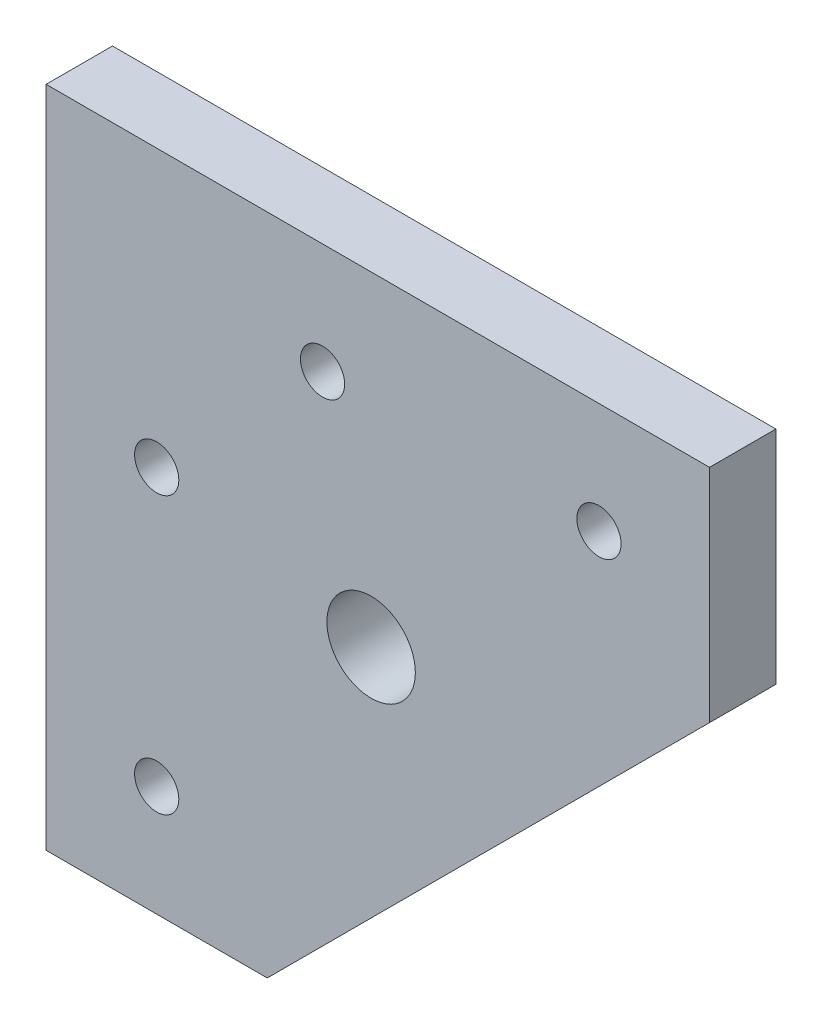
ISO-10303-21;
HEADER;
FILE_DESCRIPTION(('STEP AP214'),'2;1');
FILE_NAME('part.step','',(''),(''),'','','');
FILE_SCHEMA(('AUTOMOTIVE_DESIGN { 1 0 10303 214 1 1 1 1 }'));
ENDSEC;
DATA;
#1=APPLICATION_CONTEXT('core data for automotive mechanical design processes');
#2=APPLICATION_PROTOCOL_DEFINITION('international standard','automotive_design',2000,#1);
#3=PRODUCT_CONTEXT('',#1,'mechanical');
#4=PRODUCT('Part','Part','',(#3));
#5=PRODUCT_RELATED_PRODUCT_CATEGORY('part','',(#4));
#6=PRODUCT_DEFINITION_FORMATION('','',#4);
#7=PRODUCT_DEFINITION_CONTEXT('part definition',#1,'design');
#8=PRODUCT_DEFINITION('design','',#6,#7);
#9=PRODUCT_DEFINITION_SHAPE('','',#8);
#10=(LENGTH_UNIT() NAMED_UNIT(*) SI_UNIT(.MILLI.,.METRE.));
#11=(NAMED_UNIT(*) PLANE_ANGLE_UNIT() SI_UNIT($,.RADIAN.));
#12=(NAMED_UNIT(*) SI_UNIT($,.STERADIAN.) SOLID_ANGLE_UNIT());
#13=UNCERTAINTY_MEASURE_WITH_UNIT(LENGTH_MEASURE(1.E-05),#10,'distance_accuracy_value','');
#14=(GEOMETRIC_REPRESENTATION_CONTEXT(3) GLOBAL_UNCERTAINTY_ASSIGNED_CONTEXT((#13)) GLOBAL_UNIT_ASSIGNED_CONTEXT((#10,
#11,#12)) REPRESENTATION_CONTEXT('',''));
#15=CARTESIAN_POINT('',(0.,0.,0.));
#16=DIRECTION('',(0.,0.,1.));
#17=DIRECTION('',(1.,0.,0.));
#18=AXIS2_PLACEMENT_3D('',#15,#16,#17);
#19=CARTESIAN_POINT('',(0.,0.,6.));
#20=DIRECTION('',(0.,0.,1.));
#21=DIRECTION('',(1.,0.,0.));
#22=AXIS2_PLACEMENT_3D('',#19,#20,#21);
#23=PLANE('',#22);
#24=CARTESIAN_POINT('',(10.,-25.,6.));
#25=DIRECTION('',(0.,0.,1.));
#26=DIRECTION('',(1.,0.,0.));
#27=AXIS2_PLACEMENT_3D('',#24,#25,#26);
#28=CIRCLE('',#27,2.);
#29=CARTESIAN_POINT('',(12.,-25.,6.));
#30=VERTEX_POINT('',#29);
#31=EDGE_CURVE('E176',#30,#30,#28,.T.);
#32=ORIENTED_EDGE('',*,*,#31,.F.);
#33=EDGE_LOOP('',(#32));
#34=FACE_BOUND('',#33,.T.);
#35=CARTESIAN_POINT('',(25.,-10.,6.));
#36=DIRECTION('',(0.,0.,1.));
#37=DIRECTION('',(1.,0.,0.));
#38=AXIS2_PLACEMENT_3D('',#35,#36,#37);
#39=CIRCLE('',#38,2.);
#40=CARTESIAN_POINT('',(27.,-10.,6.));
#41=VERTEX_POINT('',#40);
#42=EDGE_CURVE('E188',#41,#41,#39,.T.);
#43=ORIENTED_EDGE('',*,*,#42,.F.);
#44=EDGE_LOOP('',(#43));
#45=FACE_BOUND('',#44,.T.);
#46=DIRECTION('',(0.,-1.,0.));
#47=VECTOR('',#46,1.);
#48=CARTESIAN_POINT('',(0.,0.,6.));
#49=LINE('',#48,#47);
#50=CARTESIAN_POINT('',(0.,0.,6.));
#51=VERTEX_POINT('',#50);
#52=CARTESIAN_POINT('',(0.,-60.,6.));
#53=VERTEX_POINT('',#52);
#54=EDGE_CURVE('E117',#51,#53,#49,.T.);
#55=ORIENTED_EDGE('',*,*,#54,.T.);
#56=DIRECTION('',(1.,0.,0.));
#57=VECTOR('',#56,1.);
#58=CARTESIAN_POINT('',(0.,-60.,6.));
#59=LINE('',#58,#57);
#60=CARTESIAN_POINT('',(20.,-60.,6.));
#61=VERTEX_POINT('',#60);
#62=EDGE_CURVE('E84',#53,#61,#59,.T.);
#63=ORIENTED_EDGE('',*,*,#62,.T.);
#64=DIRECTION('',(0.707106781186548,0.707106781186548,0.));
#65=VECTOR('',#64,1.);
#66=CARTESIAN_POINT('',(20.,-60.,6.));
#67=LINE('',#66,#65);
#68=CARTESIAN_POINT('',(60.,-20.,6.));
#69=VERTEX_POINT('',#68);
#70=EDGE_CURVE('E88',#61,#69,#67,.T.);
#71=ORIENTED_EDGE('',*,*,#70,.T.);
#72=DIRECTION('',(0.,1.,0.));
#73=VECTOR('',#72,1.);
#74=CARTESIAN_POINT('',(60.,0.,6.));
#75=LINE('',#74,#73);
#76=CARTESIAN_POINT('',(60.,0.,6.));
#77=VERTEX_POINT('',#76);
#78=EDGE_CURVE('E92',#69,#77,#75,.T.);
#79=ORIENTED_EDGE('',*,*,#78,.T.);
#80=DIRECTION('',(-1.,0.,0.));
#81=VECTOR('',#80,1.);
#82=CARTESIAN_POINT('',(0.,0.,6.));
#83=LINE('',#82,#81);
#84=EDGE_CURVE('E50',#77,#51,#83,.T.);
#85=ORIENTED_EDGE('',*,*,#84,.T.);
#86=EDGE_LOOP('',(#55,#63,#71,#79,#85));
#87=FACE_BOUND('',#86,.T.);
#88=CARTESIAN_POINT('',(50.,-10.,6.));
#89=DIRECTION('',(0.,0.,1.));
#90=DIRECTION('',(1.,0.,0.));
#91=AXIS2_PLACEMENT_3D('',#88,#89,#90);
#92=CIRCLE('',#91,2.);
#93=CARTESIAN_POINT('',(52.,-10.,6.));
#94=VERTEX_POINT('',#93);
#95=EDGE_CURVE('E112',#94,#94,#92,.T.);
#96=ORIENTED_EDGE('',*,*,#95,.F.);
#97=EDGE_LOOP('',(#96));
#98=FACE_BOUND('',#97,.T.);
#99=CARTESIAN_POINT('',(10.,-50.,6.));
#100=DIRECTION('',(0.,0.,1.));
#101=DIRECTION('',(1.,0.,0.));
#102=AXIS2_PLACEMENT_3D('',#99,#100,#101);
#103=CIRCLE('',#102,2.);
#104=CARTESIAN_POINT('',(12.,-50.,6.));
#105=VERTEX_POINT('',#104);
#106=EDGE_CURVE('E182',#105,#105,#103,.T.);
#107=ORIENTED_EDGE('',*,*,#106,.F.);
#108=EDGE_LOOP('',(#107));
#109=FACE_BOUND('',#108,.T.);
#110=CARTESIAN_POINT('',(29.3933982822018,-29.3933982822018,6.));
#111=DIRECTION('',(0.,0.,1.));
#112=DIRECTION('',(1.,0.,0.));
#113=AXIS2_PLACEMENT_3D('',#110,#111,#112);
#114=CIRCLE('',#113,4.00000000000001);
#115=CARTESIAN_POINT('',(33.3933982822018,-29.3933982822018,6.));
#116=VERTEX_POINT('',#115);
#117=EDGE_CURVE('E167',#116,#116,#114,.T.);
#118=ORIENTED_EDGE('',*,*,#117,.F.);
#119=EDGE_LOOP('',(#118));
#120=FACE_BOUND('',#119,.T.);
#121=ADVANCED_FACE('F33',(#34,#45,#87,#98,#109,#120),#23,.T.);
#122=CARTESIAN_POINT('',(0.,0.,0.));
#123=DIRECTION('',(0.,0.,1.));
#124=DIRECTION('',(1.,0.,0.));
#125=AXIS2_PLACEMENT_3D('',#122,#123,#124);
#126=PLANE('',#125);
#127=DIRECTION('',(0.,-1.,0.));
#128=VECTOR('',#127,1.);
#129=CARTESIAN_POINT('',(0.,0.,0.));
#130=LINE('',#129,#128);
#131=CARTESIAN_POINT('',(0.,0.,0.));
#132=VERTEX_POINT('',#131);
#133=CARTESIAN_POINT('',(0.,-60.,0.));
#134=VERTEX_POINT('',#133);
#135=EDGE_CURVE('E108',#132,#134,#130,.T.);
#136=ORIENTED_EDGE('',*,*,#135,.F.);
#137=DIRECTION('',(-1.,0.,0.));
#138=VECTOR('',#137,1.);
#139=CARTESIAN_POINT('',(0.,0.,0.));
#140=LINE('',#139,#138);
#141=CARTESIAN_POINT('',(60.,0.,0.));
#142=VERTEX_POINT('',#141);
#143=EDGE_CURVE('E76',#142,#132,#140,.T.);
#144=ORIENTED_EDGE('',*,*,#143,.F.);
#145=DIRECTION('',(0.,1.,0.));
#146=VECTOR('',#145,1.);
#147=CARTESIAN_POINT('',(60.,0.,0.));
#148=LINE('',#147,#146);
#149=CARTESIAN_POINT('',(60.,-20.,0.));
#150=VERTEX_POINT('',#149);
#151=EDGE_CURVE('E70',#150,#142,#148,.T.);
#152=ORIENTED_EDGE('',*,*,#151,.F.);
#153=DIRECTION('',(0.707106781186548,0.707106781186548,0.));
#154=VECTOR('',#153,1.);
#155=CARTESIAN_POINT('',(20.,-60.,0.));
#156=LINE('',#155,#154);
#157=CARTESIAN_POINT('',(20.,-60.,0.));
#158=VERTEX_POINT('',#157);
#159=EDGE_CURVE('E99',#158,#150,#156,.T.);
#160=ORIENTED_EDGE('',*,*,#159,.F.);
#161=DIRECTION('',(1.,0.,0.));
#162=VECTOR('',#161,1.);
#163=CARTESIAN_POINT('',(0.,-60.,0.));
#164=LINE('',#163,#162);
#165=EDGE_CURVE('E111',#134,#158,#164,.T.);
#166=ORIENTED_EDGE('',*,*,#165,.F.);
#167=EDGE_LOOP('',(#136,#144,#152,#160,#166));
#168=FACE_BOUND('',#167,.T.);
#169=CARTESIAN_POINT('',(50.,-10.,0.));
#170=DIRECTION('',(0.,0.,1.));
#171=DIRECTION('',(1.,0.,0.));
#172=AXIS2_PLACEMENT_3D('',#169,#170,#171);
#173=CIRCLE('',#172,2.);
#174=CARTESIAN_POINT('',(52.,-10.,0.));
#175=VERTEX_POINT('',#174);
#176=EDGE_CURVE('E191',#175,#175,#173,.T.);
#177=ORIENTED_EDGE('',*,*,#176,.T.);
#178=EDGE_LOOP('',(#177));
#179=FACE_BOUND('',#178,.T.);
#180=CARTESIAN_POINT('',(25.,-10.,0.));
#181=DIRECTION('',(0.,0.,1.));
#182=DIRECTION('',(1.,0.,0.));
#183=AXIS2_PLACEMENT_3D('',#180,#181,#182);
#184=CIRCLE('',#183,2.);
#185=CARTESIAN_POINT('',(27.,-10.,0.));
#186=VERTEX_POINT('',#185);
#187=EDGE_CURVE('E185',#186,#186,#184,.T.);
#188=ORIENTED_EDGE('',*,*,#187,.T.);
#189=EDGE_LOOP('',(#188));
#190=FACE_BOUND('',#189,.T.);
#191=CARTESIAN_POINT('',(10.,-50.,0.));
#192=DIRECTION('',(0.,0.,1.));
#193=DIRECTION('',(1.,0.,0.));
#194=AXIS2_PLACEMENT_3D('',#191,#192,#193);
#195=CIRCLE('',#194,2.);
#196=CARTESIAN_POINT('',(12.,-50.,0.));
#197=VERTEX_POINT('',#196);
#198=EDGE_CURVE('E179',#197,#197,#195,.T.);
#199=ORIENTED_EDGE('',*,*,#198,.T.);
#200=EDGE_LOOP('',(#199));
#201=FACE_BOUND('',#200,.T.);
#202=CARTESIAN_POINT('',(10.,-25.,0.));
#203=DIRECTION('',(0.,0.,1.));
#204=DIRECTION('',(1.,0.,0.));
#205=AXIS2_PLACEMENT_3D('',#202,#203,#204);
#206=CIRCLE('',#205,2.);
#207=CARTESIAN_POINT('',(12.,-25.,0.));
#208=VERTEX_POINT('',#207);
#209=EDGE_CURVE('E173',#208,#208,#206,.T.);
#210=ORIENTED_EDGE('',*,*,#209,.T.);
#211=EDGE_LOOP('',(#210));
#212=FACE_BOUND('',#211,.T.);
#213=CARTESIAN_POINT('',(29.3933982822018,-29.3933982822018,0.));
#214=DIRECTION('',(0.,0.,1.));
#215=DIRECTION('',(1.,0.,0.));
#216=AXIS2_PLACEMENT_3D('',#213,#214,#215);
#217=CIRCLE('',#216,4.00000000000001);
#218=CARTESIAN_POINT('',(33.3933982822018,-29.3933982822018,0.));
#219=VERTEX_POINT('',#218);
#220=EDGE_CURVE('E170',#219,#219,#217,.T.);
#221=ORIENTED_EDGE('',*,*,#220,.T.);
#222=EDGE_LOOP('',(#221));
#223=FACE_BOUND('',#222,.T.);
#224=ADVANCED_FACE('F121',(#168,#179,#190,#201,#212,#223),#126,.F.);
#225=CARTESIAN_POINT('',(0.,0.,6.));
#226=DIRECTION('',(1.,0.,0.));
#227=DIRECTION('',(0.,1.,0.));
#228=AXIS2_PLACEMENT_3D('',#225,#226,#227);
#229=PLANE('',#228);
#230=ORIENTED_EDGE('',*,*,#135,.T.);
#231=DIRECTION('',(0.,0.,-1.));
#232=VECTOR('',#231,1.);
#233=CARTESIAN_POINT('',(0.,-60.,6.));
#234=LINE('',#233,#232);
#235=EDGE_CURVE('E11',#53,#134,#234,.T.);
#236=ORIENTED_EDGE('',*,*,#235,.F.);
#237=ORIENTED_EDGE('',*,*,#54,.F.);
#238=DIRECTION('',(0.,0.,-1.));
#239=VECTOR('',#238,1.);
#240=CARTESIAN_POINT('',(0.,0.,6.));
#241=LINE('',#240,#239);
#242=EDGE_CURVE('E104',#51,#132,#241,.T.);
#243=ORIENTED_EDGE('',*,*,#242,.T.);
#244=EDGE_LOOP('',(#230,#236,#237,#243));
#245=FACE_BOUND('',#244,.T.);
#246=ADVANCED_FACE('F35',(#245),#229,.F.);
#247=CARTESIAN_POINT('',(0.,-60.,6.));
#248=DIRECTION('',(0.,1.,0.));
#249=DIRECTION('',(0.,0.,1.));
#250=AXIS2_PLACEMENT_3D('',#247,#248,#249);
#251=PLANE('',#250);
#252=ORIENTED_EDGE('',*,*,#165,.T.);
#253=DIRECTION('',(0.,0.,-1.));
#254=VECTOR('',#253,1.);
#255=CARTESIAN_POINT('',(20.,-60.,6.));
#256=LINE('',#255,#254);
#257=EDGE_CURVE('E42',#61,#158,#256,.T.);
#258=ORIENTED_EDGE('',*,*,#257,.F.);
#259=ORIENTED_EDGE('',*,*,#62,.F.);
#260=ORIENTED_EDGE('',*,*,#235,.T.);
#261=EDGE_LOOP('',(#252,#258,#259,#260));
#262=FACE_BOUND('',#261,.T.);
#263=ADVANCED_FACE('F249',(#262),#251,.F.);
#264=CARTESIAN_POINT('',(20.,-60.,6.));
#265=DIRECTION('',(-0.707106781186547,0.707106781186547,0.));
#266=DIRECTION('',(-0.707106781186548,-0.707106781186548,0.));
#267=AXIS2_PLACEMENT_3D('',#264,#265,#266);
#268=PLANE('',#267);
#269=ORIENTED_EDGE('',*,*,#159,.T.);
#270=DIRECTION('',(0.,0.,-1.));
#271=VECTOR('',#270,1.);
#272=CARTESIAN_POINT('',(60.,-20.,6.));
#273=LINE('',#272,#271);
#274=EDGE_CURVE('E96',#69,#150,#273,.T.);
#275=ORIENTED_EDGE('',*,*,#274,.F.);
#276=ORIENTED_EDGE('',*,*,#70,.F.);
#277=ORIENTED_EDGE('',*,*,#257,.T.);
#278=EDGE_LOOP('',(#269,#275,#276,#277));
#279=FACE_BOUND('',#278,.T.);
#280=ADVANCED_FACE('F97',(#279),#268,.F.);
#281=CARTESIAN_POINT('',(60.,0.,6.));
#282=DIRECTION('',(-1.,0.,0.));
#283=DIRECTION('',(0.,0.,1.));
#284=AXIS2_PLACEMENT_3D('',#281,#282,#283);
#285=PLANE('',#284);
#286=ORIENTED_EDGE('',*,*,#151,.T.);
#287=DIRECTION('',(0.,0.,-1.));
#288=VECTOR('',#287,1.);
#289=CARTESIAN_POINT('',(60.,0.,6.));
#290=LINE('',#289,#288);
#291=EDGE_CURVE('E100',#77,#142,#290,.T.);
#292=ORIENTED_EDGE('',*,*,#291,.F.);
#293=ORIENTED_EDGE('',*,*,#78,.F.);
#294=ORIENTED_EDGE('',*,*,#274,.T.);
#295=EDGE_LOOP('',(#286,#292,#293,#294));
#296=FACE_BOUND('',#295,.T.);
#297=ADVANCED_FACE('F102',(#296),#285,.F.);
#298=CARTESIAN_POINT('',(0.,0.,6.));
#299=DIRECTION('',(0.,-1.,0.));
#300=DIRECTION('',(0.,0.,-1.));
#301=AXIS2_PLACEMENT_3D('',#298,#299,#300);
#302=PLANE('',#301);
#303=ORIENTED_EDGE('',*,*,#143,.T.);
#304=ORIENTED_EDGE('',*,*,#242,.F.);
#305=ORIENTED_EDGE('',*,*,#84,.F.);
#306=ORIENTED_EDGE('',*,*,#291,.T.);
#307=EDGE_LOOP('',(#303,#304,#305,#306));
#308=FACE_BOUND('',#307,.T.);
#309=ADVANCED_FACE('F126',(#308),#302,.F.);
#310=CARTESIAN_POINT('',(50.,-10.,6.));
#311=DIRECTION('',(0.,0.,-1.));
#312=DIRECTION('',(-1.,0.,0.));
#313=AXIS2_PLACEMENT_3D('',#310,#311,#312);
#314=CYLINDRICAL_SURFACE('',#313,2.);
#315=ORIENTED_EDGE('',*,*,#95,.T.);
#316=EDGE_LOOP('',(#315));
#317=FACE_BOUND('',#316,.T.);
#318=ORIENTED_EDGE('',*,*,#176,.F.);
#319=EDGE_LOOP('',(#318));
#320=FACE_BOUND('',#319,.T.);
#321=ADVANCED_FACE('F128',(#317,#320),#314,.F.);
#322=CARTESIAN_POINT('',(25.,-10.,6.));
#323=DIRECTION('',(0.,0.,-1.));
#324=DIRECTION('',(-1.,0.,0.));
#325=AXIS2_PLACEMENT_3D('',#322,#323,#324);
#326=CYLINDRICAL_SURFACE('',#325,2.);
#327=ORIENTED_EDGE('',*,*,#42,.T.);
#328=EDGE_LOOP('',(#327));
#329=FACE_BOUND('',#328,.T.);
#330=ORIENTED_EDGE('',*,*,#187,.F.);
#331=EDGE_LOOP('',(#330));
#332=FACE_BOUND('',#331,.T.);
#333=ADVANCED_FACE('F134',(#329,#332),#326,.F.);
#334=CARTESIAN_POINT('',(10.,-50.,6.));
#335=DIRECTION('',(0.,0.,-1.));
#336=DIRECTION('',(-1.,0.,0.));
#337=AXIS2_PLACEMENT_3D('',#334,#335,#336);
#338=CYLINDRICAL_SURFACE('',#337,2.);
#339=ORIENTED_EDGE('',*,*,#106,.T.);
#340=EDGE_LOOP('',(#339));
#341=FACE_BOUND('',#340,.T.);
#342=ORIENTED_EDGE('',*,*,#198,.F.);
#343=EDGE_LOOP('',(#342));
#344=FACE_BOUND('',#343,.T.);
#345=ADVANCED_FACE('F150',(#341,#344),#338,.F.);
#346=CARTESIAN_POINT('',(10.,-25.,6.));
#347=DIRECTION('',(0.,0.,-1.));
#348=DIRECTION('',(-1.,0.,0.));
#349=AXIS2_PLACEMENT_3D('',#346,#347,#348);
#350=CYLINDRICAL_SURFACE('',#349,2.);
#351=ORIENTED_EDGE('',*,*,#31,.T.);
#352=EDGE_LOOP('',(#351));
#353=FACE_BOUND('',#352,.T.);
#354=ORIENTED_EDGE('',*,*,#209,.F.);
#355=EDGE_LOOP('',(#354));
#356=FACE_BOUND('',#355,.T.);
#357=ADVANCED_FACE('F154',(#353,#356),#350,.F.);
#358=CARTESIAN_POINT('',(29.3933982822018,-29.3933982822018,6.));
#359=DIRECTION('',(0.,0.,-1.));
#360=DIRECTION('',(-1.,0.,0.));
#361=AXIS2_PLACEMENT_3D('',#358,#359,#360);
#362=CYLINDRICAL_SURFACE('',#361,4.00000000000001);
#363=ORIENTED_EDGE('',*,*,#117,.T.);
#364=EDGE_LOOP('',(#363));
#365=FACE_BOUND('',#364,.T.);
#366=ORIENTED_EDGE('',*,*,#220,.F.);
#367=EDGE_LOOP('',(#366));
#368=FACE_BOUND('',#367,.T.);
#369=ADVANCED_FACE('F158',(#365,#368),#362,.F.);
#370=CLOSED_SHELL('',(#121,#224,#246,#263,#280,#297,#309,#321,#333,#345,#357,#369));
#371=MANIFOLD_SOLID_BREP('B2',#370);
#372=ADVANCED_BREP_SHAPE_REPRESENTATION('',(#18,#371),#14);
#373=SHAPE_DEFINITION_REPRESENTATION(#9,#372);
ENDSEC;
END-ISO-10303-21;
